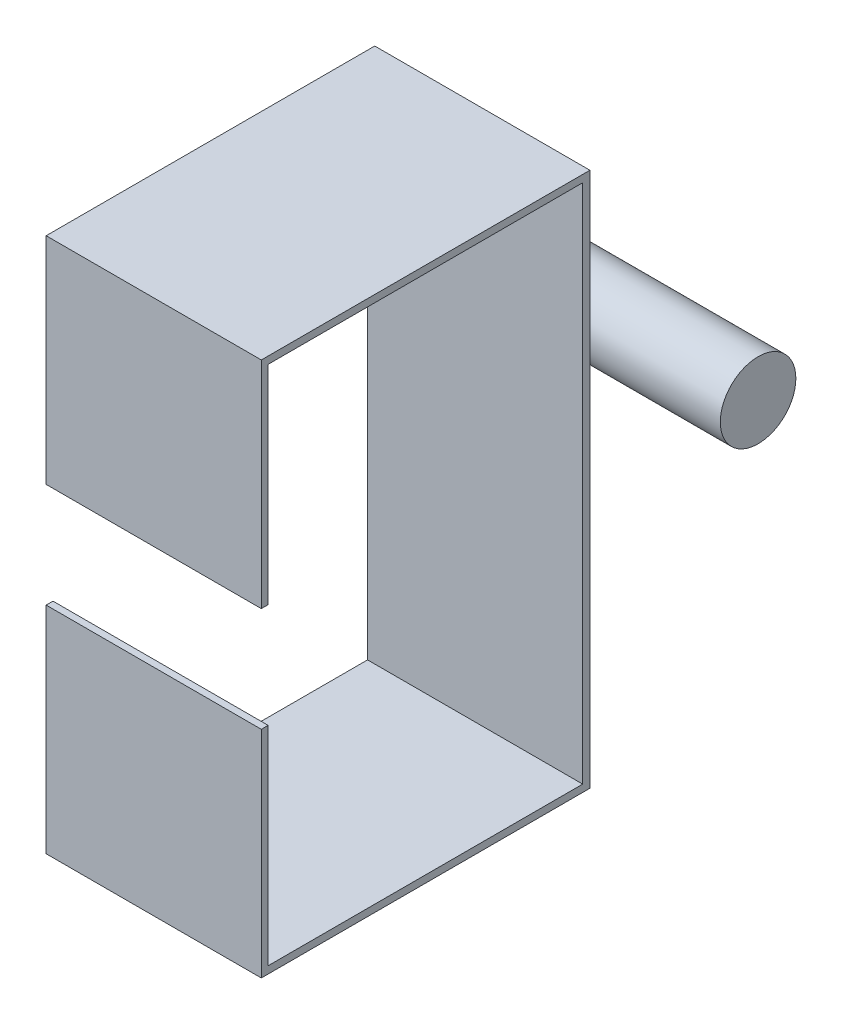
ISO-10303-21;
HEADER;
FILE_DESCRIPTION(('STEP AP214'),'2;1');
FILE_NAME('part.step','',(''),(''),'','','');
FILE_SCHEMA(('AUTOMOTIVE_DESIGN { 1 0 10303 214 1 1 1 1 }'));
ENDSEC;
DATA;
#1=APPLICATION_CONTEXT('core data for automotive mechanical design processes');
#2=APPLICATION_PROTOCOL_DEFINITION('international standard','automotive_design',2000,#1);
#3=PRODUCT_CONTEXT('',#1,'mechanical');
#4=PRODUCT('Part','Part','',(#3));
#5=PRODUCT_RELATED_PRODUCT_CATEGORY('part','',(#4));
#6=PRODUCT_DEFINITION_FORMATION('','',#4);
#7=PRODUCT_DEFINITION_CONTEXT('part definition',#1,'design');
#8=PRODUCT_DEFINITION('design','',#6,#7);
#9=PRODUCT_DEFINITION_SHAPE('','',#8);
#10=(LENGTH_UNIT() NAMED_UNIT(*) SI_UNIT(.MILLI.,.METRE.));
#11=(NAMED_UNIT(*) PLANE_ANGLE_UNIT() SI_UNIT($,.RADIAN.));
#12=(NAMED_UNIT(*) SI_UNIT($,.STERADIAN.) SOLID_ANGLE_UNIT());
#13=UNCERTAINTY_MEASURE_WITH_UNIT(LENGTH_MEASURE(1.E-05),#10,'distance_accuracy_value','');
#14=(GEOMETRIC_REPRESENTATION_CONTEXT(3) GLOBAL_UNCERTAINTY_ASSIGNED_CONTEXT((#13)) GLOBAL_UNIT_ASSIGNED_CONTEXT((#10,
#11,#12)) REPRESENTATION_CONTEXT('',''));
#15=CARTESIAN_POINT('',(0.,0.,0.));
#16=DIRECTION('',(0.,0.,1.));
#17=DIRECTION('',(1.,0.,0.));
#18=AXIS2_PLACEMENT_3D('',#15,#16,#17);
#19=CARTESIAN_POINT('',(2.54,-4.5339,-19.05));
#20=DIRECTION('',(0.,1.,0.));
#21=DIRECTION('',(0.,0.,1.));
#22=AXIS2_PLACEMENT_3D('',#19,#20,#21);
#23=PLANE('',#22);
#24=DIRECTION('',(-1.,0.,0.));
#25=VECTOR('',#24,1.);
#26=CARTESIAN_POINT('',(27.94,-4.5339,-17.871976587669));
#27=LINE('',#26,#25);
#28=CARTESIAN_POINT('',(2.54,-4.5339,-17.871976587669));
#29=VERTEX_POINT('',#28);
#30=CARTESIAN_POINT('',(0.,-4.5339,-17.871976587669));
#31=VERTEX_POINT('',#30);
#32=EDGE_CURVE('E181',#29,#31,#27,.T.);
#33=ORIENTED_EDGE('',*,*,#32,.F.);
#34=DIRECTION('',(0.,0.,-1.));
#35=VECTOR('',#34,1.);
#36=CARTESIAN_POINT('',(2.54,-4.5339,-19.05));
#37=LINE('',#36,#35);
#38=CARTESIAN_POINT('',(2.54,-4.5339,0.));
#39=VERTEX_POINT('',#38);
#40=EDGE_CURVE('E162',#39,#29,#37,.T.);
#41=ORIENTED_EDGE('',*,*,#40,.F.);
#42=DIRECTION('',(-1.,0.,0.));
#43=VECTOR('',#42,1.);
#44=CARTESIAN_POINT('',(2.54,-4.5339,0.));
#45=LINE('',#44,#43);
#46=CARTESIAN_POINT('',(0.,-4.5339,0.));
#47=VERTEX_POINT('',#46);
#48=EDGE_CURVE('E171',#39,#47,#45,.T.);
#49=ORIENTED_EDGE('',*,*,#48,.T.);
#50=DIRECTION('',(0.,0.,-1.));
#51=VECTOR('',#50,1.);
#52=CARTESIAN_POINT('',(0.,-4.5339,-19.05));
#53=LINE('',#52,#51);
#54=EDGE_CURVE('E182',#47,#31,#53,.T.);
#55=ORIENTED_EDGE('',*,*,#54,.T.);
#56=EDGE_LOOP('',(#33,#41,#49,#55));
#57=FACE_BOUND('',#56,.T.);
#58=ADVANCED_FACE('F45',(#57),#23,.F.);
#59=CARTESIAN_POINT('',(2.54,4.5339,0.));
#60=DIRECTION('',(0.,-1.,0.));
#61=DIRECTION('',(0.,0.,-1.));
#62=AXIS2_PLACEMENT_3D('',#59,#60,#61);
#63=PLANE('',#62);
#64=DIRECTION('',(-1.,0.,0.));
#65=VECTOR('',#64,1.);
#66=CARTESIAN_POINT('',(27.94,4.5339,-17.871976587669));
#67=LINE('',#66,#65);
#68=CARTESIAN_POINT('',(0.,4.5339,-17.871976587669));
#69=VERTEX_POINT('',#68);
#70=CARTESIAN_POINT('',(2.54,4.5339,-17.871976587669));
#71=VERTEX_POINT('',#70);
#72=EDGE_CURVE('E284',#69,#71,#67,.F.);
#73=ORIENTED_EDGE('',*,*,#72,.F.);
#74=DIRECTION('',(0.,0.,1.));
#75=VECTOR('',#74,1.);
#76=CARTESIAN_POINT('',(0.,4.5339,0.));
#77=LINE('',#76,#75);
#78=CARTESIAN_POINT('',(0.,4.53389999999999,0.));
#79=VERTEX_POINT('',#78);
#80=EDGE_CURVE('E169',#69,#79,#77,.T.);
#81=ORIENTED_EDGE('',*,*,#80,.T.);
#82=DIRECTION('',(-1.,0.,0.));
#83=VECTOR('',#82,1.);
#84=CARTESIAN_POINT('',(2.54,4.5339,0.));
#85=LINE('',#84,#83);
#86=CARTESIAN_POINT('',(2.54,4.5339,0.));
#87=VERTEX_POINT('',#86);
#88=EDGE_CURVE('E167',#87,#79,#85,.T.);
#89=ORIENTED_EDGE('',*,*,#88,.F.);
#90=DIRECTION('',(0.,0.,1.));
#91=VECTOR('',#90,1.);
#92=CARTESIAN_POINT('',(2.54,4.5339,0.));
#93=LINE('',#92,#91);
#94=EDGE_CURVE('E152',#71,#87,#93,.T.);
#95=ORIENTED_EDGE('',*,*,#94,.F.);
#96=EDGE_LOOP('',(#73,#81,#89,#95));
#97=FACE_BOUND('',#96,.T.);
#98=ADVANCED_FACE('F170',(#97),#63,.F.);
#99=CARTESIAN_POINT('',(2.54,0.,-18.4609882938345));
#100=DIRECTION('',(1.,0.,0.));
#101=DIRECTION('',(0.,0.,-1.));
#102=AXIS2_PLACEMENT_3D('',#99,#100,#101);
#103=PLANE('',#102);
#104=ORIENTED_EDGE('',*,*,#40,.T.);
#105=CARTESIAN_POINT('',(2.54,0.,-18.4609882938345));
#106=DIRECTION('',(1.,0.,0.));
#107=DIRECTION('',(0.,0.,-1.));
#108=AXIS2_PLACEMENT_3D('',#105,#106,#107);
#109=CIRCLE('',#108,4.572);
#110=EDGE_CURVE('E11',#29,#71,#109,.F.);
#111=ORIENTED_EDGE('',*,*,#110,.T.);
#112=ORIENTED_EDGE('',*,*,#94,.T.);
#113=DIRECTION('',(0.,-1.,0.));
#114=VECTOR('',#113,1.);
#115=CARTESIAN_POINT('',(2.54,-4.5339,0.));
#116=LINE('',#115,#114);
#117=EDGE_CURVE('E157',#87,#39,#116,.T.);
#118=ORIENTED_EDGE('',*,*,#117,.T.);
#119=EDGE_LOOP('',(#104,#111,#112,#118));
#120=FACE_BOUND('',#119,.T.);
#121=ADVANCED_FACE('F160',(#120),#103,.T.);
#122=CARTESIAN_POINT('',(26.04516,-32.39516,0.));
#123=DIRECTION('',(0.,0.,1.));
#124=DIRECTION('',(1.,0.,0.));
#125=AXIS2_PLACEMENT_3D('',#122,#123,#124);
#126=PLANE('',#125);
#127=ORIENTED_EDGE('',*,*,#48,.F.);
#128=ORIENTED_EDGE('',*,*,#117,.F.);
#129=ORIENTED_EDGE('',*,*,#88,.T.);
#130=DIRECTION('',(0.,1.,0.));
#131=VECTOR('',#130,1.);
#132=CARTESIAN_POINT('',(0.,-32.39516,0.));
#133=LINE('',#132,#131);
#134=CARTESIAN_POINT('',(0.,32.39516,0.));
#135=VERTEX_POINT('',#134);
#136=EDGE_CURVE('E214',#79,#135,#133,.T.);
#137=ORIENTED_EDGE('',*,*,#136,.T.);
#138=DIRECTION('',(-1.,0.,0.));
#139=VECTOR('',#138,1.);
#140=CARTESIAN_POINT('',(26.04516,32.39516,0.));
#141=LINE('',#140,#139);
#142=CARTESIAN_POINT('',(26.04516,32.39516,0.));
#143=VERTEX_POINT('',#142);
#144=EDGE_CURVE('E266',#143,#135,#141,.T.);
#145=ORIENTED_EDGE('',*,*,#144,.F.);
#146=DIRECTION('',(0.,1.,0.));
#147=VECTOR('',#146,1.);
#148=CARTESIAN_POINT('',(26.04516,-32.39516,0.));
#149=LINE('',#148,#147);
#150=CARTESIAN_POINT('',(26.04516,-32.39516,0.));
#151=VERTEX_POINT('',#150);
#152=EDGE_CURVE('E188',#151,#143,#149,.T.);
#153=ORIENTED_EDGE('',*,*,#152,.F.);
#154=DIRECTION('',(-1.,0.,0.));
#155=VECTOR('',#154,1.);
#156=CARTESIAN_POINT('',(26.04516,-32.39516,0.));
#157=LINE('',#156,#155);
#158=CARTESIAN_POINT('',(0.,-32.39516,0.));
#159=VERTEX_POINT('',#158);
#160=EDGE_CURVE('E49',#151,#159,#157,.T.);
#161=ORIENTED_EDGE('',*,*,#160,.T.);
#162=EDGE_CURVE('E216',#159,#47,#133,.T.);
#163=ORIENTED_EDGE('',*,*,#162,.T.);
#164=EDGE_LOOP('',(#127,#128,#129,#137,#145,#153,#161,#163));
#165=FACE_BOUND('',#164,.T.);
#166=ADVANCED_FACE('F172',(#165),#126,.F.);
#167=CARTESIAN_POINT('',(26.04516,-32.39516,39.7764));
#168=DIRECTION('',(0.,1.,0.));
#169=DIRECTION('',(0.,0.,1.));
#170=AXIS2_PLACEMENT_3D('',#167,#168,#169);
#171=PLANE('',#170);
#172=DIRECTION('',(0.,0.,-1.));
#173=VECTOR('',#172,1.);
#174=CARTESIAN_POINT('',(0.,-32.39516,39.7764));
#175=LINE('',#174,#173);
#176=CARTESIAN_POINT('',(0.,-32.39516,39.7764));
#177=VERTEX_POINT('',#176);
#178=EDGE_CURVE('E174',#177,#159,#175,.T.);
#179=ORIENTED_EDGE('',*,*,#178,.T.);
#180=ORIENTED_EDGE('',*,*,#160,.F.);
#181=DIRECTION('',(0.,0.,-1.));
#182=VECTOR('',#181,1.);
#183=CARTESIAN_POINT('',(26.04516,-32.39516,39.7764));
#184=LINE('',#183,#182);
#185=CARTESIAN_POINT('',(26.04516,-32.39516,39.7764));
#186=VERTEX_POINT('',#185);
#187=EDGE_CURVE('E189',#186,#151,#184,.T.);
#188=ORIENTED_EDGE('',*,*,#187,.F.);
#189=DIRECTION('',(-1.,0.,0.));
#190=VECTOR('',#189,1.);
#191=CARTESIAN_POINT('',(26.04516,-32.39516,39.7764));
#192=LINE('',#191,#190);
#193=EDGE_CURVE('E215',#186,#177,#192,.T.);
#194=ORIENTED_EDGE('',*,*,#193,.T.);
#195=EDGE_LOOP('',(#179,#180,#188,#194));
#196=FACE_BOUND('',#195,.T.);
#197=ADVANCED_FACE('F42',(#196),#171,.F.);
#198=CARTESIAN_POINT('',(26.04516,32.39516,0.));
#199=DIRECTION('',(0.,-1.,0.));
#200=DIRECTION('',(0.,0.,-1.));
#201=AXIS2_PLACEMENT_3D('',#198,#199,#200);
#202=PLANE('',#201);
#203=DIRECTION('',(0.,0.,1.));
#204=VECTOR('',#203,1.);
#205=CARTESIAN_POINT('',(0.,32.39516,0.));
#206=LINE('',#205,#204);
#207=CARTESIAN_POINT('',(0.,32.39516,39.7764));
#208=VERTEX_POINT('',#207);
#209=EDGE_CURVE('E217',#135,#208,#206,.T.);
#210=ORIENTED_EDGE('',*,*,#209,.T.);
#211=DIRECTION('',(-1.,0.,0.));
#212=VECTOR('',#211,1.);
#213=CARTESIAN_POINT('',(26.04516,32.39516,39.7764));
#214=LINE('',#213,#212);
#215=CARTESIAN_POINT('',(26.04516,32.39516,39.7764));
#216=VERTEX_POINT('',#215);
#217=EDGE_CURVE('E263',#216,#208,#214,.T.);
#218=ORIENTED_EDGE('',*,*,#217,.F.);
#219=DIRECTION('',(0.,0.,1.));
#220=VECTOR('',#219,1.);
#221=CARTESIAN_POINT('',(26.04516,32.39516,0.));
#222=LINE('',#221,#220);
#223=EDGE_CURVE('E195',#143,#216,#222,.T.);
#224=ORIENTED_EDGE('',*,*,#223,.F.);
#225=ORIENTED_EDGE('',*,*,#144,.T.);
#226=EDGE_LOOP('',(#210,#218,#224,#225));
#227=FACE_BOUND('',#226,.T.);
#228=ADVANCED_FACE('F341',(#227),#202,.F.);
#229=CARTESIAN_POINT('',(26.04516,32.39516,39.7764));
#230=DIRECTION('',(0.,0.,-1.));
#231=DIRECTION('',(0.,1.,0.));
#232=AXIS2_PLACEMENT_3D('',#229,#230,#231);
#233=PLANE('',#232);
#234=DIRECTION('',(0.,-1.,0.));
#235=VECTOR('',#234,1.);
#236=CARTESIAN_POINT('',(0.,32.39516,39.7764));
#237=LINE('',#236,#235);
#238=CARTESIAN_POINT('',(0.,6.3246,39.7764));
#239=VERTEX_POINT('',#238);
#240=EDGE_CURVE('E219',#208,#239,#237,.T.);
#241=ORIENTED_EDGE('',*,*,#240,.T.);
#242=DIRECTION('',(-1.,0.,0.));
#243=VECTOR('',#242,1.);
#244=CARTESIAN_POINT('',(26.04516,6.3246,39.7764));
#245=LINE('',#244,#243);
#246=CARTESIAN_POINT('',(26.04516,6.3246,39.7764));
#247=VERTEX_POINT('',#246);
#248=EDGE_CURVE('E257',#247,#239,#245,.T.);
#249=ORIENTED_EDGE('',*,*,#248,.F.);
#250=DIRECTION('',(0.,-1.,0.));
#251=VECTOR('',#250,1.);
#252=CARTESIAN_POINT('',(26.04516,32.39516,39.7764));
#253=LINE('',#252,#251);
#254=EDGE_CURVE('E192',#216,#247,#253,.T.);
#255=ORIENTED_EDGE('',*,*,#254,.F.);
#256=ORIENTED_EDGE('',*,*,#217,.T.);
#257=EDGE_LOOP('',(#241,#249,#255,#256));
#258=FACE_BOUND('',#257,.T.);
#259=ADVANCED_FACE('F342',(#258),#233,.F.);
#260=CARTESIAN_POINT('',(26.04516,6.3246,39.7764));
#261=DIRECTION('',(0.,1.,0.));
#262=DIRECTION('',(0.,0.,1.));
#263=AXIS2_PLACEMENT_3D('',#260,#261,#262);
#264=PLANE('',#263);
#265=DIRECTION('',(0.,0.,-1.));
#266=VECTOR('',#265,1.);
#267=CARTESIAN_POINT('',(0.,6.3246,39.7764));
#268=LINE('',#267,#266);
#269=CARTESIAN_POINT('',(0.,6.3246,38.94836));
#270=VERTEX_POINT('',#269);
#271=EDGE_CURVE('E225',#239,#270,#268,.T.);
#272=ORIENTED_EDGE('',*,*,#271,.T.);
#273=DIRECTION('',(-1.,0.,0.));
#274=VECTOR('',#273,1.);
#275=CARTESIAN_POINT('',(26.04516,6.3246,38.94836));
#276=LINE('',#275,#274);
#277=CARTESIAN_POINT('',(26.04516,6.3246,38.94836));
#278=VERTEX_POINT('',#277);
#279=EDGE_CURVE('E260',#278,#270,#276,.T.);
#280=ORIENTED_EDGE('',*,*,#279,.F.);
#281=DIRECTION('',(0.,0.,-1.));
#282=VECTOR('',#281,1.);
#283=CARTESIAN_POINT('',(26.04516,6.3246,39.7764));
#284=LINE('',#283,#282);
#285=EDGE_CURVE('E198',#247,#278,#284,.T.);
#286=ORIENTED_EDGE('',*,*,#285,.F.);
#287=ORIENTED_EDGE('',*,*,#248,.T.);
#288=EDGE_LOOP('',(#272,#280,#286,#287));
#289=FACE_BOUND('',#288,.T.);
#290=ADVANCED_FACE('F336',(#289),#264,.F.);
#291=CARTESIAN_POINT('',(26.04516,6.3246,38.94836));
#292=DIRECTION('',(0.,0.,1.));
#293=DIRECTION('',(1.,0.,0.));
#294=AXIS2_PLACEMENT_3D('',#291,#292,#293);
#295=PLANE('',#294);
#296=DIRECTION('',(0.,1.,0.));
#297=VECTOR('',#296,1.);
#298=CARTESIAN_POINT('',(0.,6.3246,38.94836));
#299=LINE('',#298,#297);
#300=CARTESIAN_POINT('',(0.,31.5214,38.94836));
#301=VERTEX_POINT('',#300);
#302=EDGE_CURVE('E221',#270,#301,#299,.T.);
#303=ORIENTED_EDGE('',*,*,#302,.T.);
#304=DIRECTION('',(-1.,0.,0.));
#305=VECTOR('',#304,1.);
#306=CARTESIAN_POINT('',(26.04516,31.5214,38.94836));
#307=LINE('',#306,#305);
#308=CARTESIAN_POINT('',(26.04516,31.5214,38.94836));
#309=VERTEX_POINT('',#308);
#310=EDGE_CURVE('E255',#309,#301,#307,.T.);
#311=ORIENTED_EDGE('',*,*,#310,.F.);
#312=DIRECTION('',(0.,1.,0.));
#313=VECTOR('',#312,1.);
#314=CARTESIAN_POINT('',(26.04516,6.3246,38.94836));
#315=LINE('',#314,#313);
#316=EDGE_CURVE('E196',#278,#309,#315,.T.);
#317=ORIENTED_EDGE('',*,*,#316,.F.);
#318=ORIENTED_EDGE('',*,*,#279,.T.);
#319=EDGE_LOOP('',(#303,#311,#317,#318));
#320=FACE_BOUND('',#319,.T.);
#321=ADVANCED_FACE('F334',(#320),#295,.F.);
#322=CARTESIAN_POINT('',(26.04516,31.5214,38.94836));
#323=DIRECTION('',(0.,1.,0.));
#324=DIRECTION('',(0.,0.,1.));
#325=AXIS2_PLACEMENT_3D('',#322,#323,#324);
#326=PLANE('',#325);
#327=DIRECTION('',(0.,0.,-1.));
#328=VECTOR('',#327,1.);
#329=CARTESIAN_POINT('',(0.,31.5214,38.94836));
#330=LINE('',#329,#328);
#331=CARTESIAN_POINT('',(0.,31.5214,0.873759999999999));
#332=VERTEX_POINT('',#331);
#333=EDGE_CURVE('E229',#301,#332,#330,.T.);
#334=ORIENTED_EDGE('',*,*,#333,.T.);
#335=DIRECTION('',(-1.,0.,0.));
#336=VECTOR('',#335,1.);
#337=CARTESIAN_POINT('',(26.04516,31.5214,0.873759999999999));
#338=LINE('',#337,#336);
#339=CARTESIAN_POINT('',(26.04516,31.5214,0.873759999999999));
#340=VERTEX_POINT('',#339);
#341=EDGE_CURVE('E253',#340,#332,#338,.T.);
#342=ORIENTED_EDGE('',*,*,#341,.F.);
#343=DIRECTION('',(0.,0.,-1.));
#344=VECTOR('',#343,1.);
#345=CARTESIAN_POINT('',(26.04516,31.5214,38.94836));
#346=LINE('',#345,#344);
#347=EDGE_CURVE('E199',#309,#340,#346,.T.);
#348=ORIENTED_EDGE('',*,*,#347,.F.);
#349=ORIENTED_EDGE('',*,*,#310,.T.);
#350=EDGE_LOOP('',(#334,#342,#348,#349));
#351=FACE_BOUND('',#350,.T.);
#352=ADVANCED_FACE('F328',(#351),#326,.F.);
#353=CARTESIAN_POINT('',(26.04516,31.5214,0.873759999999999));
#354=DIRECTION('',(0.,0.,-1.));
#355=DIRECTION('',(0.,1.,0.));
#356=AXIS2_PLACEMENT_3D('',#353,#354,#355);
#357=PLANE('',#356);
#358=DIRECTION('',(0.,-1.,0.));
#359=VECTOR('',#358,1.);
#360=CARTESIAN_POINT('',(0.,31.5214,0.873759999999999));
#361=LINE('',#360,#359);
#362=CARTESIAN_POINT('',(0.,-31.5214,0.873759999999991));
#363=VERTEX_POINT('',#362);
#364=EDGE_CURVE('E230',#332,#363,#361,.T.);
#365=ORIENTED_EDGE('',*,*,#364,.T.);
#366=DIRECTION('',(-1.,0.,0.));
#367=VECTOR('',#366,1.);
#368=CARTESIAN_POINT('',(26.04516,-31.5214,0.873759999999991));
#369=LINE('',#368,#367);
#370=CARTESIAN_POINT('',(26.04516,-31.5214,0.873759999999991));
#371=VERTEX_POINT('',#370);
#372=EDGE_CURVE('E246',#371,#363,#369,.T.);
#373=ORIENTED_EDGE('',*,*,#372,.F.);
#374=DIRECTION('',(0.,-1.,0.));
#375=VECTOR('',#374,1.);
#376=CARTESIAN_POINT('',(26.04516,31.5214,0.873759999999999));
#377=LINE('',#376,#375);
#378=EDGE_CURVE('E205',#340,#371,#377,.T.);
#379=ORIENTED_EDGE('',*,*,#378,.F.);
#380=ORIENTED_EDGE('',*,*,#341,.T.);
#381=EDGE_LOOP('',(#365,#373,#379,#380));
#382=FACE_BOUND('',#381,.T.);
#383=ADVANCED_FACE('F324',(#382),#357,.F.);
#384=CARTESIAN_POINT('',(26.04516,-31.5214,0.873759999999991));
#385=DIRECTION('',(0.,-1.,0.));
#386=DIRECTION('',(0.,0.,-1.));
#387=AXIS2_PLACEMENT_3D('',#384,#385,#386);
#388=PLANE('',#387);
#389=DIRECTION('',(0.,0.,1.));
#390=VECTOR('',#389,1.);
#391=CARTESIAN_POINT('',(0.,-31.5214,0.873759999999991));
#392=LINE('',#391,#390);
#393=CARTESIAN_POINT('',(0.,-31.5214,38.94836));
#394=VERTEX_POINT('',#393);
#395=EDGE_CURVE('E227',#363,#394,#392,.T.);
#396=ORIENTED_EDGE('',*,*,#395,.T.);
#397=DIRECTION('',(-1.,0.,0.));
#398=VECTOR('',#397,1.);
#399=CARTESIAN_POINT('',(26.04516,-31.5214,38.94836));
#400=LINE('',#399,#398);
#401=CARTESIAN_POINT('',(26.04516,-31.5214,38.94836));
#402=VERTEX_POINT('',#401);
#403=EDGE_CURVE('E242',#402,#394,#400,.T.);
#404=ORIENTED_EDGE('',*,*,#403,.F.);
#405=DIRECTION('',(0.,0.,1.));
#406=VECTOR('',#405,1.);
#407=CARTESIAN_POINT('',(26.04516,-31.5214,0.873759999999991));
#408=LINE('',#407,#406);
#409=EDGE_CURVE('E204',#371,#402,#408,.T.);
#410=ORIENTED_EDGE('',*,*,#409,.F.);
#411=ORIENTED_EDGE('',*,*,#372,.T.);
#412=EDGE_LOOP('',(#396,#404,#410,#411));
#413=FACE_BOUND('',#412,.T.);
#414=ADVANCED_FACE('F321',(#413),#388,.F.);
#415=CARTESIAN_POINT('',(26.04516,-31.5214,38.94836));
#416=DIRECTION('',(0.,0.,1.));
#417=DIRECTION('',(1.,0.,0.));
#418=AXIS2_PLACEMENT_3D('',#415,#416,#417);
#419=PLANE('',#418);
#420=DIRECTION('',(0.,1.,0.));
#421=VECTOR('',#420,1.);
#422=CARTESIAN_POINT('',(0.,-31.5214,38.94836));
#423=LINE('',#422,#421);
#424=CARTESIAN_POINT('',(0.,-6.32460000000001,38.94836));
#425=VERTEX_POINT('',#424);
#426=EDGE_CURVE('E235',#394,#425,#423,.T.);
#427=ORIENTED_EDGE('',*,*,#426,.T.);
#428=DIRECTION('',(-1.,0.,0.));
#429=VECTOR('',#428,1.);
#430=CARTESIAN_POINT('',(26.04516,-6.32460000000001,38.94836));
#431=LINE('',#430,#429);
#432=CARTESIAN_POINT('',(26.04516,-6.32460000000001,38.94836));
#433=VERTEX_POINT('',#432);
#434=EDGE_CURVE('E241',#433,#425,#431,.T.);
#435=ORIENTED_EDGE('',*,*,#434,.F.);
#436=DIRECTION('',(0.,1.,0.));
#437=VECTOR('',#436,1.);
#438=CARTESIAN_POINT('',(26.04516,-31.5214,38.94836));
#439=LINE('',#438,#437);
#440=EDGE_CURVE('E206',#402,#433,#439,.T.);
#441=ORIENTED_EDGE('',*,*,#440,.F.);
#442=ORIENTED_EDGE('',*,*,#403,.T.);
#443=EDGE_LOOP('',(#427,#435,#441,#442));
#444=FACE_BOUND('',#443,.T.);
#445=ADVANCED_FACE('F320',(#444),#419,.F.);
#446=CARTESIAN_POINT('',(26.04516,-6.32460000000001,38.94836));
#447=DIRECTION('',(0.,-1.,0.));
#448=DIRECTION('',(0.,0.,-1.));
#449=AXIS2_PLACEMENT_3D('',#446,#447,#448);
#450=PLANE('',#449);
#451=DIRECTION('',(0.,0.,1.));
#452=VECTOR('',#451,1.);
#453=CARTESIAN_POINT('',(0.,-6.32460000000001,38.94836));
#454=LINE('',#453,#452);
#455=CARTESIAN_POINT('',(0.,-6.32460000000001,39.7764));
#456=VERTEX_POINT('',#455);
#457=EDGE_CURVE('E234',#425,#456,#454,.T.);
#458=ORIENTED_EDGE('',*,*,#457,.T.);
#459=DIRECTION('',(-1.,0.,0.));
#460=VECTOR('',#459,1.);
#461=CARTESIAN_POINT('',(26.04516,-6.32460000000001,39.7764));
#462=LINE('',#461,#460);
#463=CARTESIAN_POINT('',(26.04516,-6.32460000000001,39.7764));
#464=VERTEX_POINT('',#463);
#465=EDGE_CURVE('E239',#464,#456,#462,.T.);
#466=ORIENTED_EDGE('',*,*,#465,.F.);
#467=DIRECTION('',(0.,0.,1.));
#468=VECTOR('',#467,1.);
#469=CARTESIAN_POINT('',(26.04516,-6.32460000000001,38.94836));
#470=LINE('',#469,#468);
#471=EDGE_CURVE('E208',#433,#464,#470,.T.);
#472=ORIENTED_EDGE('',*,*,#471,.F.);
#473=ORIENTED_EDGE('',*,*,#434,.T.);
#474=EDGE_LOOP('',(#458,#466,#472,#473));
#475=FACE_BOUND('',#474,.T.);
#476=ADVANCED_FACE('F311',(#475),#450,.F.);
#477=CARTESIAN_POINT('',(26.04516,-6.32460000000001,39.7764));
#478=DIRECTION('',(0.,0.,-1.));
#479=DIRECTION('',(0.,1.,0.));
#480=AXIS2_PLACEMENT_3D('',#477,#478,#479);
#481=PLANE('',#480);
#482=DIRECTION('',(0.,-1.,0.));
#483=VECTOR('',#482,1.);
#484=CARTESIAN_POINT('',(0.,-6.32460000000001,39.7764));
#485=LINE('',#484,#483);
#486=EDGE_CURVE('E187',#456,#177,#485,.T.);
#487=ORIENTED_EDGE('',*,*,#486,.T.);
#488=ORIENTED_EDGE('',*,*,#193,.F.);
#489=DIRECTION('',(0.,-1.,0.));
#490=VECTOR('',#489,1.);
#491=CARTESIAN_POINT('',(26.04516,-6.32460000000001,39.7764));
#492=LINE('',#491,#490);
#493=EDGE_CURVE('E209',#464,#186,#492,.T.);
#494=ORIENTED_EDGE('',*,*,#493,.F.);
#495=ORIENTED_EDGE('',*,*,#465,.T.);
#496=EDGE_LOOP('',(#487,#488,#494,#495));
#497=FACE_BOUND('',#496,.T.);
#498=ADVANCED_FACE('F306',(#497),#481,.F.);
#499=CARTESIAN_POINT('',(26.04516,0.,0.));
#500=DIRECTION('',(1.,0.,0.));
#501=DIRECTION('',(0.,0.,-1.));
#502=AXIS2_PLACEMENT_3D('',#499,#500,#501);
#503=PLANE('',#502);
#504=ORIENTED_EDGE('',*,*,#187,.T.);
#505=ORIENTED_EDGE('',*,*,#152,.T.);
#506=ORIENTED_EDGE('',*,*,#223,.T.);
#507=ORIENTED_EDGE('',*,*,#254,.T.);
#508=ORIENTED_EDGE('',*,*,#285,.T.);
#509=ORIENTED_EDGE('',*,*,#316,.T.);
#510=ORIENTED_EDGE('',*,*,#347,.T.);
#511=ORIENTED_EDGE('',*,*,#378,.T.);
#512=ORIENTED_EDGE('',*,*,#409,.T.);
#513=ORIENTED_EDGE('',*,*,#440,.T.);
#514=ORIENTED_EDGE('',*,*,#471,.T.);
#515=ORIENTED_EDGE('',*,*,#493,.T.);
#516=EDGE_LOOP('',(#504,#505,#506,#507,#508,#509,#510,#511,#512,#513,#514,#515));
#517=FACE_BOUND('',#516,.T.);
#518=ADVANCED_FACE('F296',(#517),#503,.T.);
#519=CARTESIAN_POINT('',(0.,0.,0.));
#520=DIRECTION('',(1.,0.,0.));
#521=DIRECTION('',(0.,0.,-1.));
#522=AXIS2_PLACEMENT_3D('',#519,#520,#521);
#523=PLANE('',#522);
#524=CARTESIAN_POINT('',(0.,0.,-18.4609882938345));
#525=DIRECTION('',(1.,0.,0.));
#526=DIRECTION('',(0.,0.,-1.));
#527=AXIS2_PLACEMENT_3D('',#524,#525,#526);
#528=CIRCLE('',#527,4.572);
#529=EDGE_CURVE('E60',#31,#69,#528,.T.);
#530=ORIENTED_EDGE('',*,*,#529,.F.);
#531=ORIENTED_EDGE('',*,*,#54,.F.);
#532=ORIENTED_EDGE('',*,*,#162,.F.);
#533=ORIENTED_EDGE('',*,*,#178,.F.);
#534=ORIENTED_EDGE('',*,*,#486,.F.);
#535=ORIENTED_EDGE('',*,*,#457,.F.);
#536=ORIENTED_EDGE('',*,*,#426,.F.);
#537=ORIENTED_EDGE('',*,*,#395,.F.);
#538=ORIENTED_EDGE('',*,*,#364,.F.);
#539=ORIENTED_EDGE('',*,*,#333,.F.);
#540=ORIENTED_EDGE('',*,*,#302,.F.);
#541=ORIENTED_EDGE('',*,*,#271,.F.);
#542=ORIENTED_EDGE('',*,*,#240,.F.);
#543=ORIENTED_EDGE('',*,*,#209,.F.);
#544=ORIENTED_EDGE('',*,*,#136,.F.);
#545=ORIENTED_EDGE('',*,*,#80,.F.);
#546=EDGE_LOOP('',(#530,#531,#532,#533,#534,#535,#536,#537,#538,#539,#540,#541,#542,#543,#544,#545));
#547=FACE_BOUND('',#546,.T.);
#548=ADVANCED_FACE('F277',(#547),#523,.F.);
#549=CARTESIAN_POINT('',(2.54,0.,-18.4609882938345));
#550=DIRECTION('',(-1.,0.,0.));
#551=DIRECTION('',(0.,0.,1.));
#552=AXIS2_PLACEMENT_3D('',#549,#550,#551);
#553=CYLINDRICAL_SURFACE('',#552,4.572);
#554=ORIENTED_EDGE('',*,*,#529,.T.);
#555=ORIENTED_EDGE('',*,*,#72,.T.);
#556=ORIENTED_EDGE('',*,*,#110,.F.);
#557=ORIENTED_EDGE('',*,*,#32,.T.);
#558=EDGE_LOOP('',(#554,#555,#556,#557));
#559=FACE_BOUND('',#558,.T.);
#560=CARTESIAN_POINT('',(27.94,0.,-18.4609882938345));
#561=DIRECTION('',(1.,0.,0.));
#562=DIRECTION('',(0.,0.,-1.));
#563=AXIS2_PLACEMENT_3D('',#560,#561,#562);
#564=CIRCLE('',#563,4.572);
#565=CARTESIAN_POINT('',(27.94,0.,-23.0329882938345));
#566=VERTEX_POINT('',#565);
#567=EDGE_CURVE('E285',#566,#566,#564,.T.);
#568=ORIENTED_EDGE('',*,*,#567,.F.);
#569=EDGE_LOOP('',(#568));
#570=FACE_BOUND('',#569,.T.);
#571=ADVANCED_FACE('F276',(#559,#570),#553,.T.);
#572=CARTESIAN_POINT('',(27.94,0.,-18.4609882938345));
#573=DIRECTION('',(1.,0.,0.));
#574=DIRECTION('',(0.,0.,-1.));
#575=AXIS2_PLACEMENT_3D('',#572,#573,#574);
#576=PLANE('',#575);
#577=ORIENTED_EDGE('',*,*,#567,.T.);
#578=EDGE_LOOP('',(#577));
#579=FACE_BOUND('',#578,.T.);
#580=ADVANCED_FACE('F289',(#579),#576,.T.);
#581=CLOSED_SHELL('',(#58,#98,#121,#166,#197,#228,#259,#290,#321,#352,#383,#414,#445,#476,#498,
#518,#548,#571,#580));
#582=MANIFOLD_SOLID_BREP('B2',#581);
#583=ADVANCED_BREP_SHAPE_REPRESENTATION('',(#18,#582),#14);
#584=SHAPE_DEFINITION_REPRESENTATION(#9,#583);
ENDSEC;
END-ISO-10303-21;
